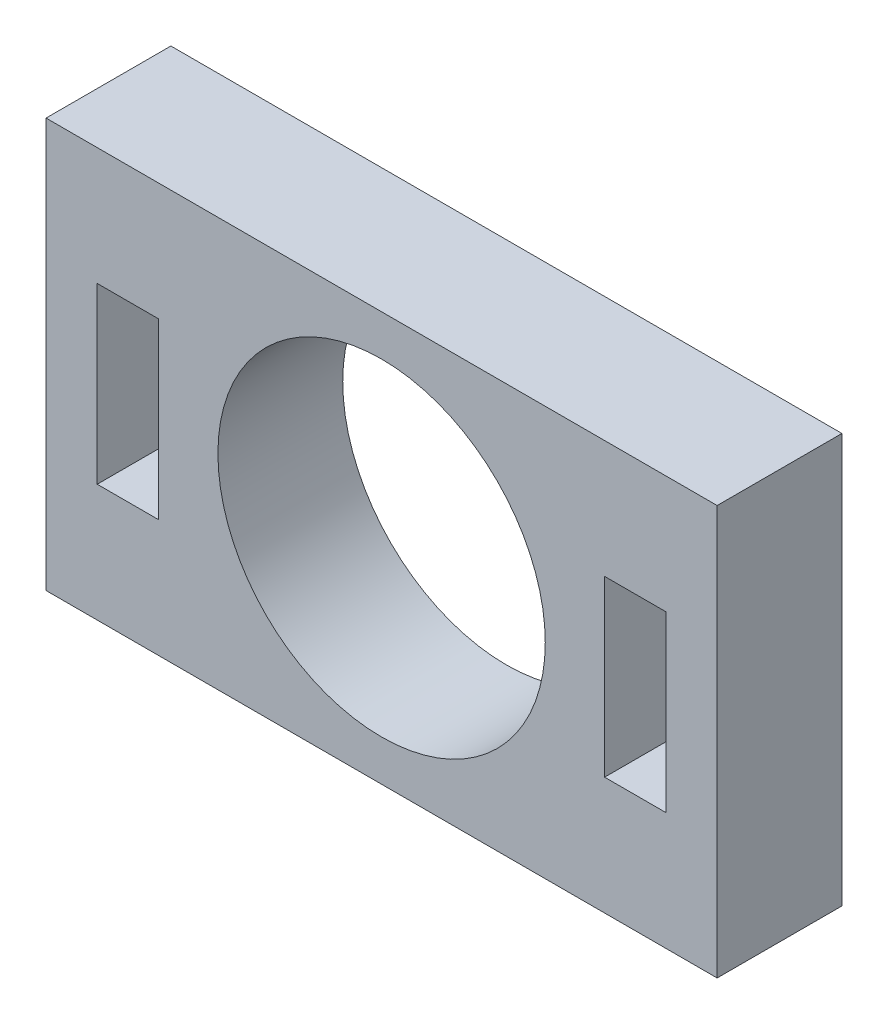
ISO-10303-21;
HEADER;
FILE_DESCRIPTION(('STEP AP214'),'2;1');
FILE_NAME('part.step','',(''),(''),'','','');
FILE_SCHEMA(('AUTOMOTIVE_DESIGN { 1 0 10303 214 1 1 1 1 }'));
ENDSEC;
DATA;
#1=APPLICATION_CONTEXT('core data for automotive mechanical design processes');
#2=APPLICATION_PROTOCOL_DEFINITION('international standard','automotive_design',2000,#1);
#3=PRODUCT_CONTEXT('',#1,'mechanical');
#4=PRODUCT('Part','Part','',(#3));
#5=PRODUCT_RELATED_PRODUCT_CATEGORY('part','',(#4));
#6=PRODUCT_DEFINITION_FORMATION('','',#4);
#7=PRODUCT_DEFINITION_CONTEXT('part definition',#1,'design');
#8=PRODUCT_DEFINITION('design','',#6,#7);
#9=PRODUCT_DEFINITION_SHAPE('','',#8);
#10=(LENGTH_UNIT() NAMED_UNIT(*) SI_UNIT(.MILLI.,.METRE.));
#11=(NAMED_UNIT(*) PLANE_ANGLE_UNIT() SI_UNIT($,.RADIAN.));
#12=(NAMED_UNIT(*) SI_UNIT($,.STERADIAN.) SOLID_ANGLE_UNIT());
#13=UNCERTAINTY_MEASURE_WITH_UNIT(LENGTH_MEASURE(1.E-05),#10,'distance_accuracy_value','');
#14=(GEOMETRIC_REPRESENTATION_CONTEXT(3) GLOBAL_UNCERTAINTY_ASSIGNED_CONTEXT((#13)) GLOBAL_UNIT_ASSIGNED_CONTEXT((#10,
#11,#12)) REPRESENTATION_CONTEXT('',''));
#15=CARTESIAN_POINT('',(0.,0.,0.));
#16=DIRECTION('',(0.,0.,1.));
#17=DIRECTION('',(1.,0.,0.));
#18=AXIS2_PLACEMENT_3D('',#15,#16,#17);
#19=CARTESIAN_POINT('',(0.,0.,6.1));
#20=DIRECTION('',(0.,0.,-1.));
#21=DIRECTION('',(-1.,0.,0.));
#22=AXIS2_PLACEMENT_3D('',#19,#20,#21);
#23=PLANE('',#22);
#24=DIRECTION('',(0.,1.,0.));
#25=VECTOR('',#24,1.);
#26=CARTESIAN_POINT('',(13.9,-4.25,6.1));
#27=LINE('',#26,#25);
#28=CARTESIAN_POINT('',(13.9,-4.25,6.1));
#29=VERTEX_POINT('',#28);
#30=CARTESIAN_POINT('',(13.9,4.25,6.1));
#31=VERTEX_POINT('',#30);
#32=EDGE_CURVE('E161',#29,#31,#27,.T.);
#33=ORIENTED_EDGE('',*,*,#32,.F.);
#34=DIRECTION('',(1.,0.,0.));
#35=VECTOR('',#34,1.);
#36=CARTESIAN_POINT('',(10.9,-4.25,6.1));
#37=LINE('',#36,#35);
#38=CARTESIAN_POINT('',(10.9,-4.25,6.1));
#39=VERTEX_POINT('',#38);
#40=EDGE_CURVE('E169',#39,#29,#37,.T.);
#41=ORIENTED_EDGE('',*,*,#40,.F.);
#42=DIRECTION('',(0.,-1.,0.));
#43=VECTOR('',#42,1.);
#44=CARTESIAN_POINT('',(10.9,-4.25,6.1));
#45=LINE('',#44,#43);
#46=CARTESIAN_POINT('',(10.9,4.25,6.1));
#47=VERTEX_POINT('',#46);
#48=EDGE_CURVE('E166',#47,#39,#45,.T.);
#49=ORIENTED_EDGE('',*,*,#48,.F.);
#50=DIRECTION('',(-1.,0.,0.));
#51=VECTOR('',#50,1.);
#52=CARTESIAN_POINT('',(10.9,4.25,6.1));
#53=LINE('',#52,#51);
#54=EDGE_CURVE('E163',#31,#47,#53,.T.);
#55=ORIENTED_EDGE('',*,*,#54,.F.);
#56=EDGE_LOOP('',(#33,#41,#49,#55));
#57=FACE_BOUND('',#56,.T.);
#58=DIRECTION('',(0.,1.,0.));
#59=VECTOR('',#58,1.);
#60=CARTESIAN_POINT('',(16.4,-10.,6.1));
#61=LINE('',#60,#59);
#62=CARTESIAN_POINT('',(16.4,-10.,6.1));
#63=VERTEX_POINT('',#62);
#64=CARTESIAN_POINT('',(16.4,10.,6.1));
#65=VERTEX_POINT('',#64);
#66=EDGE_CURVE('E198',#63,#65,#61,.T.);
#67=ORIENTED_EDGE('',*,*,#66,.T.);
#68=DIRECTION('',(-1.,0.,0.));
#69=VECTOR('',#68,1.);
#70=CARTESIAN_POINT('',(-16.4,10.,6.1));
#71=LINE('',#70,#69);
#72=CARTESIAN_POINT('',(-16.4,10.,6.1));
#73=VERTEX_POINT('',#72);
#74=EDGE_CURVE('E201',#65,#73,#71,.T.);
#75=ORIENTED_EDGE('',*,*,#74,.T.);
#76=DIRECTION('',(0.,-1.,0.));
#77=VECTOR('',#76,1.);
#78=CARTESIAN_POINT('',(-16.4,-10.,6.1));
#79=LINE('',#78,#77);
#80=CARTESIAN_POINT('',(-16.4,-10.,6.1));
#81=VERTEX_POINT('',#80);
#82=EDGE_CURVE('E204',#73,#81,#79,.T.);
#83=ORIENTED_EDGE('',*,*,#82,.T.);
#84=DIRECTION('',(1.,0.,0.));
#85=VECTOR('',#84,1.);
#86=CARTESIAN_POINT('',(-16.4,-10.,6.1));
#87=LINE('',#86,#85);
#88=EDGE_CURVE('E206',#81,#63,#87,.T.);
#89=ORIENTED_EDGE('',*,*,#88,.T.);
#90=EDGE_LOOP('',(#67,#75,#83,#89));
#91=FACE_BOUND('',#90,.T.);
#92=CARTESIAN_POINT('',(0.,0.,6.1));
#93=DIRECTION('',(0.,0.,1.));
#94=DIRECTION('',(1.,0.,0.));
#95=AXIS2_PLACEMENT_3D('',#92,#93,#94);
#96=CIRCLE('',#95,8.);
#97=CARTESIAN_POINT('',(8.,0.,6.1));
#98=VERTEX_POINT('',#97);
#99=EDGE_CURVE('E192',#98,#98,#96,.T.);
#100=ORIENTED_EDGE('',*,*,#99,.F.);
#101=EDGE_LOOP('',(#100));
#102=FACE_BOUND('',#101,.T.);
#103=DIRECTION('',(0.,1.,0.));
#104=VECTOR('',#103,1.);
#105=CARTESIAN_POINT('',(-10.9,-4.25,6.1));
#106=LINE('',#105,#104);
#107=CARTESIAN_POINT('',(-10.9,-4.25,6.1));
#108=VERTEX_POINT('',#107);
#109=CARTESIAN_POINT('',(-10.9,4.25,6.1));
#110=VERTEX_POINT('',#109);
#111=EDGE_CURVE('E125',#108,#110,#106,.T.);
#112=ORIENTED_EDGE('',*,*,#111,.F.);
#113=DIRECTION('',(1.,0.,0.));
#114=VECTOR('',#113,1.);
#115=CARTESIAN_POINT('',(-13.9,-4.25,6.1));
#116=LINE('',#115,#114);
#117=CARTESIAN_POINT('',(-13.9,-4.25,6.1));
#118=VERTEX_POINT('',#117);
#119=EDGE_CURVE('E147',#118,#108,#116,.T.);
#120=ORIENTED_EDGE('',*,*,#119,.F.);
#121=DIRECTION('',(0.,-1.,0.));
#122=VECTOR('',#121,1.);
#123=CARTESIAN_POINT('',(-13.9,-4.25,6.1));
#124=LINE('',#123,#122);
#125=CARTESIAN_POINT('',(-13.9,4.25,6.1));
#126=VERTEX_POINT('',#125);
#127=EDGE_CURVE('E145',#126,#118,#124,.T.);
#128=ORIENTED_EDGE('',*,*,#127,.F.);
#129=DIRECTION('',(-1.,0.,0.));
#130=VECTOR('',#129,1.);
#131=CARTESIAN_POINT('',(-13.9,4.25,6.1));
#132=LINE('',#131,#130);
#133=EDGE_CURVE('E133',#110,#126,#132,.T.);
#134=ORIENTED_EDGE('',*,*,#133,.F.);
#135=EDGE_LOOP('',(#112,#120,#128,#134));
#136=FACE_BOUND('',#135,.T.);
#137=ADVANCED_FACE('F36',(#57,#91,#102,#136),#23,.F.);
#138=CARTESIAN_POINT('',(0.,0.,0.));
#139=DIRECTION('',(0.,0.,-1.));
#140=DIRECTION('',(-1.,0.,0.));
#141=AXIS2_PLACEMENT_3D('',#138,#139,#140);
#142=PLANE('',#141);
#143=DIRECTION('',(0.,1.,0.));
#144=VECTOR('',#143,1.);
#145=CARTESIAN_POINT('',(16.4,-10.,0.));
#146=LINE('',#145,#144);
#147=CARTESIAN_POINT('',(16.4,-10.,0.));
#148=VERTEX_POINT('',#147);
#149=CARTESIAN_POINT('',(16.4,10.,0.));
#150=VERTEX_POINT('',#149);
#151=EDGE_CURVE('E195',#148,#150,#146,.T.);
#152=ORIENTED_EDGE('',*,*,#151,.F.);
#153=DIRECTION('',(1.,0.,0.));
#154=VECTOR('',#153,1.);
#155=CARTESIAN_POINT('',(-16.4,-10.,0.));
#156=LINE('',#155,#154);
#157=CARTESIAN_POINT('',(-16.4,-10.,0.));
#158=VERTEX_POINT('',#157);
#159=EDGE_CURVE('E202',#158,#148,#156,.T.);
#160=ORIENTED_EDGE('',*,*,#159,.F.);
#161=DIRECTION('',(0.,-1.,0.));
#162=VECTOR('',#161,1.);
#163=CARTESIAN_POINT('',(-16.4,-10.,0.));
#164=LINE('',#163,#162);
#165=CARTESIAN_POINT('',(-16.4,10.,0.));
#166=VERTEX_POINT('',#165);
#167=EDGE_CURVE('E213',#166,#158,#164,.T.);
#168=ORIENTED_EDGE('',*,*,#167,.F.);
#169=DIRECTION('',(-1.,0.,0.));
#170=VECTOR('',#169,1.);
#171=CARTESIAN_POINT('',(-16.4,10.,0.));
#172=LINE('',#171,#170);
#173=EDGE_CURVE('E211',#150,#166,#172,.T.);
#174=ORIENTED_EDGE('',*,*,#173,.F.);
#175=EDGE_LOOP('',(#152,#160,#168,#174));
#176=FACE_BOUND('',#175,.T.);
#177=CARTESIAN_POINT('',(0.,0.,0.));
#178=DIRECTION('',(0.,0.,1.));
#179=DIRECTION('',(1.,0.,0.));
#180=AXIS2_PLACEMENT_3D('',#177,#178,#179);
#181=CIRCLE('',#180,8.);
#182=CARTESIAN_POINT('',(8.,0.,0.));
#183=VERTEX_POINT('',#182);
#184=EDGE_CURVE('E191',#183,#183,#181,.T.);
#185=ORIENTED_EDGE('',*,*,#184,.T.);
#186=EDGE_LOOP('',(#185));
#187=FACE_BOUND('',#186,.T.);
#188=DIRECTION('',(1.,0.,0.));
#189=VECTOR('',#188,1.);
#190=CARTESIAN_POINT('',(10.9,-4.25,0.));
#191=LINE('',#190,#189);
#192=CARTESIAN_POINT('',(10.9,-4.25,0.));
#193=VERTEX_POINT('',#192);
#194=CARTESIAN_POINT('',(13.9,-4.25,0.));
#195=VERTEX_POINT('',#194);
#196=EDGE_CURVE('E164',#193,#195,#191,.T.);
#197=ORIENTED_EDGE('',*,*,#196,.T.);
#198=DIRECTION('',(0.,1.,0.));
#199=VECTOR('',#198,1.);
#200=CARTESIAN_POINT('',(13.9,-4.25,0.));
#201=LINE('',#200,#199);
#202=CARTESIAN_POINT('',(13.9,4.25,0.));
#203=VERTEX_POINT('',#202);
#204=EDGE_CURVE('E141',#195,#203,#201,.T.);
#205=ORIENTED_EDGE('',*,*,#204,.T.);
#206=DIRECTION('',(-1.,0.,0.));
#207=VECTOR('',#206,1.);
#208=CARTESIAN_POINT('',(10.9,4.25,0.));
#209=LINE('',#208,#207);
#210=CARTESIAN_POINT('',(10.9,4.25,0.));
#211=VERTEX_POINT('',#210);
#212=EDGE_CURVE('E174',#203,#211,#209,.T.);
#213=ORIENTED_EDGE('',*,*,#212,.T.);
#214=DIRECTION('',(0.,-1.,0.));
#215=VECTOR('',#214,1.);
#216=CARTESIAN_POINT('',(10.9,-4.25,0.));
#217=LINE('',#216,#215);
#218=EDGE_CURVE('E177',#211,#193,#217,.T.);
#219=ORIENTED_EDGE('',*,*,#218,.T.);
#220=EDGE_LOOP('',(#197,#205,#213,#219));
#221=FACE_BOUND('',#220,.T.);
#222=DIRECTION('',(1.,0.,0.));
#223=VECTOR('',#222,1.);
#224=CARTESIAN_POINT('',(-13.9,-4.25,0.));
#225=LINE('',#224,#223);
#226=CARTESIAN_POINT('',(-13.9,-4.25,0.));
#227=VERTEX_POINT('',#226);
#228=CARTESIAN_POINT('',(-10.9,-4.25,0.));
#229=VERTEX_POINT('',#228);
#230=EDGE_CURVE('E134',#227,#229,#225,.T.);
#231=ORIENTED_EDGE('',*,*,#230,.T.);
#232=DIRECTION('',(0.,1.,0.));
#233=VECTOR('',#232,1.);
#234=CARTESIAN_POINT('',(-10.9,-4.25,0.));
#235=LINE('',#234,#233);
#236=CARTESIAN_POINT('',(-10.9,4.25,0.));
#237=VERTEX_POINT('',#236);
#238=EDGE_CURVE('E59',#229,#237,#235,.T.);
#239=ORIENTED_EDGE('',*,*,#238,.T.);
#240=DIRECTION('',(-1.,0.,0.));
#241=VECTOR('',#240,1.);
#242=CARTESIAN_POINT('',(-13.9,4.25,0.));
#243=LINE('',#242,#241);
#244=CARTESIAN_POINT('',(-13.9,4.25,0.));
#245=VERTEX_POINT('',#244);
#246=EDGE_CURVE('E140',#237,#245,#243,.T.);
#247=ORIENTED_EDGE('',*,*,#246,.T.);
#248=DIRECTION('',(0.,-1.,0.));
#249=VECTOR('',#248,1.);
#250=CARTESIAN_POINT('',(-13.9,-4.25,0.));
#251=LINE('',#250,#249);
#252=EDGE_CURVE('E153',#245,#227,#251,.T.);
#253=ORIENTED_EDGE('',*,*,#252,.T.);
#254=EDGE_LOOP('',(#231,#239,#247,#253));
#255=FACE_BOUND('',#254,.T.);
#256=ADVANCED_FACE('F231',(#176,#187,#221,#255),#142,.T.);
#257=CARTESIAN_POINT('',(16.4,-10.,6.1));
#258=DIRECTION('',(-1.,0.,0.));
#259=DIRECTION('',(0.,0.,1.));
#260=AXIS2_PLACEMENT_3D('',#257,#258,#259);
#261=PLANE('',#260);
#262=ORIENTED_EDGE('',*,*,#151,.T.);
#263=DIRECTION('',(0.,0.,-1.));
#264=VECTOR('',#263,1.);
#265=CARTESIAN_POINT('',(16.4,10.,6.1));
#266=LINE('',#265,#264);
#267=EDGE_CURVE('E11',#65,#150,#266,.T.);
#268=ORIENTED_EDGE('',*,*,#267,.F.);
#269=ORIENTED_EDGE('',*,*,#66,.F.);
#270=DIRECTION('',(0.,0.,-1.));
#271=VECTOR('',#270,1.);
#272=CARTESIAN_POINT('',(16.4,-10.,6.1));
#273=LINE('',#272,#271);
#274=EDGE_CURVE('E208',#63,#148,#273,.T.);
#275=ORIENTED_EDGE('',*,*,#274,.T.);
#276=EDGE_LOOP('',(#262,#268,#269,#275));
#277=FACE_BOUND('',#276,.T.);
#278=ADVANCED_FACE('F38',(#277),#261,.F.);
#279=CARTESIAN_POINT('',(-16.4,10.,6.1));
#280=DIRECTION('',(0.,-1.,0.));
#281=DIRECTION('',(0.,0.,-1.));
#282=AXIS2_PLACEMENT_3D('',#279,#280,#281);
#283=PLANE('',#282);
#284=ORIENTED_EDGE('',*,*,#173,.T.);
#285=DIRECTION('',(0.,0.,-1.));
#286=VECTOR('',#285,1.);
#287=CARTESIAN_POINT('',(-16.4,10.,6.1));
#288=LINE('',#287,#286);
#289=EDGE_CURVE('E44',#73,#166,#288,.T.);
#290=ORIENTED_EDGE('',*,*,#289,.F.);
#291=ORIENTED_EDGE('',*,*,#74,.F.);
#292=ORIENTED_EDGE('',*,*,#267,.T.);
#293=EDGE_LOOP('',(#284,#290,#291,#292));
#294=FACE_BOUND('',#293,.T.);
#295=ADVANCED_FACE('F242',(#294),#283,.F.);
#296=CARTESIAN_POINT('',(-16.4,-10.,6.1));
#297=DIRECTION('',(1.,0.,0.));
#298=DIRECTION('',(0.,0.,-1.));
#299=AXIS2_PLACEMENT_3D('',#296,#297,#298);
#300=PLANE('',#299);
#301=ORIENTED_EDGE('',*,*,#167,.T.);
#302=DIRECTION('',(0.,0.,-1.));
#303=VECTOR('',#302,1.);
#304=CARTESIAN_POINT('',(-16.4,-10.,6.1));
#305=LINE('',#304,#303);
#306=EDGE_CURVE('E218',#81,#158,#305,.T.);
#307=ORIENTED_EDGE('',*,*,#306,.F.);
#308=ORIENTED_EDGE('',*,*,#82,.F.);
#309=ORIENTED_EDGE('',*,*,#289,.T.);
#310=EDGE_LOOP('',(#301,#307,#308,#309));
#311=FACE_BOUND('',#310,.T.);
#312=ADVANCED_FACE('F225',(#311),#300,.F.);
#313=CARTESIAN_POINT('',(-16.4,-10.,6.1));
#314=DIRECTION('',(0.,1.,0.));
#315=DIRECTION('',(0.,0.,1.));
#316=AXIS2_PLACEMENT_3D('',#313,#314,#315);
#317=PLANE('',#316);
#318=ORIENTED_EDGE('',*,*,#159,.T.);
#319=ORIENTED_EDGE('',*,*,#274,.F.);
#320=ORIENTED_EDGE('',*,*,#88,.F.);
#321=ORIENTED_EDGE('',*,*,#306,.T.);
#322=EDGE_LOOP('',(#318,#319,#320,#321));
#323=FACE_BOUND('',#322,.T.);
#324=ADVANCED_FACE('F235',(#323),#317,.F.);
#325=CARTESIAN_POINT('',(0.,0.,6.1));
#326=DIRECTION('',(0.,0.,-1.));
#327=DIRECTION('',(-1.,0.,0.));
#328=AXIS2_PLACEMENT_3D('',#325,#326,#327);
#329=CYLINDRICAL_SURFACE('',#328,8.);
#330=ORIENTED_EDGE('',*,*,#99,.T.);
#331=EDGE_LOOP('',(#330));
#332=FACE_BOUND('',#331,.T.);
#333=ORIENTED_EDGE('',*,*,#184,.F.);
#334=EDGE_LOOP('',(#333));
#335=FACE_BOUND('',#334,.T.);
#336=ADVANCED_FACE('F258',(#332,#335),#329,.F.);
#337=CARTESIAN_POINT('',(13.9,-4.25,6.1));
#338=DIRECTION('',(-1.,0.,0.));
#339=DIRECTION('',(0.,0.,1.));
#340=AXIS2_PLACEMENT_3D('',#337,#338,#339);
#341=PLANE('',#340);
#342=ORIENTED_EDGE('',*,*,#204,.F.);
#343=DIRECTION('',(0.,0.,-1.));
#344=VECTOR('',#343,1.);
#345=CARTESIAN_POINT('',(13.9,-4.25,6.1));
#346=LINE('',#345,#344);
#347=EDGE_CURVE('E171',#29,#195,#346,.T.);
#348=ORIENTED_EDGE('',*,*,#347,.F.);
#349=ORIENTED_EDGE('',*,*,#32,.T.);
#350=DIRECTION('',(0.,0.,-1.));
#351=VECTOR('',#350,1.);
#352=CARTESIAN_POINT('',(13.9,4.25,6.1));
#353=LINE('',#352,#351);
#354=EDGE_CURVE('E188',#31,#203,#353,.T.);
#355=ORIENTED_EDGE('',*,*,#354,.T.);
#356=EDGE_LOOP('',(#342,#348,#349,#355));
#357=FACE_BOUND('',#356,.T.);
#358=ADVANCED_FACE('F265',(#357),#341,.T.);
#359=CARTESIAN_POINT('',(10.9,4.25,6.1));
#360=DIRECTION('',(0.,-1.,0.));
#361=DIRECTION('',(0.,0.,-1.));
#362=AXIS2_PLACEMENT_3D('',#359,#360,#361);
#363=PLANE('',#362);
#364=ORIENTED_EDGE('',*,*,#212,.F.);
#365=ORIENTED_EDGE('',*,*,#354,.F.);
#366=ORIENTED_EDGE('',*,*,#54,.T.);
#367=DIRECTION('',(0.,0.,-1.));
#368=VECTOR('',#367,1.);
#369=CARTESIAN_POINT('',(10.9,4.25,6.1));
#370=LINE('',#369,#368);
#371=EDGE_CURVE('E186',#47,#211,#370,.T.);
#372=ORIENTED_EDGE('',*,*,#371,.T.);
#373=EDGE_LOOP('',(#364,#365,#366,#372));
#374=FACE_BOUND('',#373,.T.);
#375=ADVANCED_FACE('F270',(#374),#363,.T.);
#376=CARTESIAN_POINT('',(10.9,-4.25,6.1));
#377=DIRECTION('',(1.,0.,0.));
#378=DIRECTION('',(0.,0.,-1.));
#379=AXIS2_PLACEMENT_3D('',#376,#377,#378);
#380=PLANE('',#379);
#381=ORIENTED_EDGE('',*,*,#218,.F.);
#382=ORIENTED_EDGE('',*,*,#371,.F.);
#383=ORIENTED_EDGE('',*,*,#48,.T.);
#384=DIRECTION('',(0.,0.,-1.));
#385=VECTOR('',#384,1.);
#386=CARTESIAN_POINT('',(10.9,-4.25,6.1));
#387=LINE('',#386,#385);
#388=EDGE_CURVE('E184',#39,#193,#387,.T.);
#389=ORIENTED_EDGE('',*,*,#388,.T.);
#390=EDGE_LOOP('',(#381,#382,#383,#389));
#391=FACE_BOUND('',#390,.T.);
#392=ADVANCED_FACE('F296',(#391),#380,.T.);
#393=CARTESIAN_POINT('',(10.9,-4.25,6.1));
#394=DIRECTION('',(0.,1.,0.));
#395=DIRECTION('',(0.,0.,1.));
#396=AXIS2_PLACEMENT_3D('',#393,#394,#395);
#397=PLANE('',#396);
#398=ORIENTED_EDGE('',*,*,#196,.F.);
#399=ORIENTED_EDGE('',*,*,#388,.F.);
#400=ORIENTED_EDGE('',*,*,#40,.T.);
#401=ORIENTED_EDGE('',*,*,#347,.T.);
#402=EDGE_LOOP('',(#398,#399,#400,#401));
#403=FACE_BOUND('',#402,.T.);
#404=ADVANCED_FACE('F293',(#403),#397,.T.);
#405=CARTESIAN_POINT('',(-10.9,-4.25,6.1));
#406=DIRECTION('',(-1.,0.,0.));
#407=DIRECTION('',(0.,0.,1.));
#408=AXIS2_PLACEMENT_3D('',#405,#406,#407);
#409=PLANE('',#408);
#410=ORIENTED_EDGE('',*,*,#238,.F.);
#411=DIRECTION('',(0.,0.,-1.));
#412=VECTOR('',#411,1.);
#413=CARTESIAN_POINT('',(-10.9,-4.25,6.1));
#414=LINE('',#413,#412);
#415=EDGE_CURVE('E129',#108,#229,#414,.T.);
#416=ORIENTED_EDGE('',*,*,#415,.F.);
#417=ORIENTED_EDGE('',*,*,#111,.T.);
#418=DIRECTION('',(0.,0.,-1.));
#419=VECTOR('',#418,1.);
#420=CARTESIAN_POINT('',(-10.9,4.25,6.1));
#421=LINE('',#420,#419);
#422=EDGE_CURVE('E128',#110,#237,#421,.T.);
#423=ORIENTED_EDGE('',*,*,#422,.T.);
#424=EDGE_LOOP('',(#410,#416,#417,#423));
#425=FACE_BOUND('',#424,.T.);
#426=ADVANCED_FACE('F127',(#425),#409,.T.);
#427=CARTESIAN_POINT('',(-13.9,4.25,6.1));
#428=DIRECTION('',(0.,-1.,0.));
#429=DIRECTION('',(0.,0.,-1.));
#430=AXIS2_PLACEMENT_3D('',#427,#428,#429);
#431=PLANE('',#430);
#432=ORIENTED_EDGE('',*,*,#246,.F.);
#433=ORIENTED_EDGE('',*,*,#422,.F.);
#434=ORIENTED_EDGE('',*,*,#133,.T.);
#435=DIRECTION('',(0.,0.,-1.));
#436=VECTOR('',#435,1.);
#437=CARTESIAN_POINT('',(-13.9,4.25,6.1));
#438=LINE('',#437,#436);
#439=EDGE_CURVE('E142',#126,#245,#438,.T.);
#440=ORIENTED_EDGE('',*,*,#439,.T.);
#441=EDGE_LOOP('',(#432,#433,#434,#440));
#442=FACE_BOUND('',#441,.T.);
#443=ADVANCED_FACE('F137',(#442),#431,.T.);
#444=CARTESIAN_POINT('',(-13.9,-4.25,6.1));
#445=DIRECTION('',(1.,0.,0.));
#446=DIRECTION('',(0.,0.,-1.));
#447=AXIS2_PLACEMENT_3D('',#444,#445,#446);
#448=PLANE('',#447);
#449=ORIENTED_EDGE('',*,*,#252,.F.);
#450=ORIENTED_EDGE('',*,*,#439,.F.);
#451=ORIENTED_EDGE('',*,*,#127,.T.);
#452=DIRECTION('',(0.,0.,-1.));
#453=VECTOR('',#452,1.);
#454=CARTESIAN_POINT('',(-13.9,-4.25,6.1));
#455=LINE('',#454,#453);
#456=EDGE_CURVE('E51',#118,#227,#455,.T.);
#457=ORIENTED_EDGE('',*,*,#456,.T.);
#458=EDGE_LOOP('',(#449,#450,#451,#457));
#459=FACE_BOUND('',#458,.T.);
#460=ADVANCED_FACE('F281',(#459),#448,.T.);
#461=CARTESIAN_POINT('',(-13.9,-4.25,6.1));
#462=DIRECTION('',(0.,1.,0.));
#463=DIRECTION('',(0.,0.,1.));
#464=AXIS2_PLACEMENT_3D('',#461,#462,#463);
#465=PLANE('',#464);
#466=ORIENTED_EDGE('',*,*,#230,.F.);
#467=ORIENTED_EDGE('',*,*,#456,.F.);
#468=ORIENTED_EDGE('',*,*,#119,.T.);
#469=ORIENTED_EDGE('',*,*,#415,.T.);
#470=EDGE_LOOP('',(#466,#467,#468,#469));
#471=FACE_BOUND('',#470,.T.);
#472=ADVANCED_FACE('F279',(#471),#465,.T.);
#473=CLOSED_SHELL('',(#137,#256,#278,#295,#312,#324,#336,#358,#375,#392,#404,#426,#443,#460,#472));
#474=MANIFOLD_SOLID_BREP('B2',#473);
#475=ADVANCED_BREP_SHAPE_REPRESENTATION('',(#18,#474),#14);
#476=SHAPE_DEFINITION_REPRESENTATION(#9,#475);
ENDSEC;
END-ISO-10303-21;
